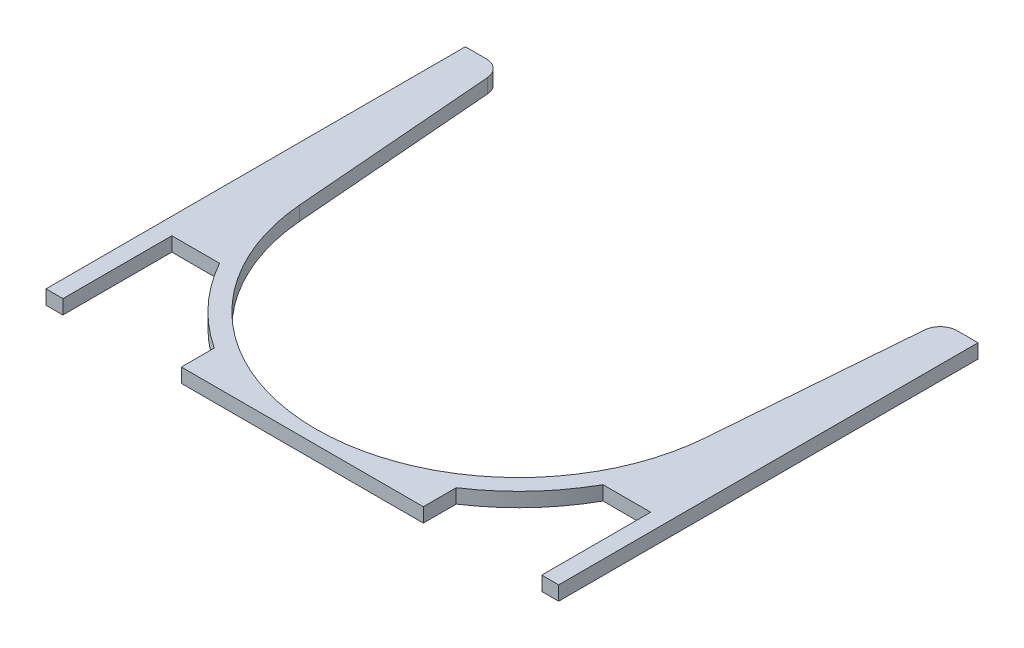
ISO-10303-21;
HEADER;
FILE_DESCRIPTION(('STEP AP214'),'2;1');
FILE_NAME('part.step','',(''),(''),'','','');
FILE_SCHEMA(('AUTOMOTIVE_DESIGN { 1 0 10303 214 1 1 1 1 }'));
ENDSEC;
DATA;
#1=APPLICATION_CONTEXT('core data for automotive mechanical design processes');
#2=APPLICATION_PROTOCOL_DEFINITION('international standard','automotive_design',2000,#1);
#3=PRODUCT_CONTEXT('',#1,'mechanical');
#4=PRODUCT('Part','Part','',(#3));
#5=PRODUCT_RELATED_PRODUCT_CATEGORY('part','',(#4));
#6=PRODUCT_DEFINITION_FORMATION('','',#4);
#7=PRODUCT_DEFINITION_CONTEXT('part definition',#1,'design');
#8=PRODUCT_DEFINITION('design','',#6,#7);
#9=PRODUCT_DEFINITION_SHAPE('','',#8);
#10=(LENGTH_UNIT() NAMED_UNIT(*) SI_UNIT(.MILLI.,.METRE.));
#11=(NAMED_UNIT(*) PLANE_ANGLE_UNIT() SI_UNIT($,.RADIAN.));
#12=(NAMED_UNIT(*) SI_UNIT($,.STERADIAN.) SOLID_ANGLE_UNIT());
#13=UNCERTAINTY_MEASURE_WITH_UNIT(LENGTH_MEASURE(1.E-05),#10,'distance_accuracy_value','');
#14=(GEOMETRIC_REPRESENTATION_CONTEXT(3) GLOBAL_UNCERTAINTY_ASSIGNED_CONTEXT((#13)) GLOBAL_UNIT_ASSIGNED_CONTEXT((#10,
#11,#12)) REPRESENTATION_CONTEXT('',''));
#15=CARTESIAN_POINT('',(0.,0.,0.));
#16=DIRECTION('',(0.,0.,1.));
#17=DIRECTION('',(1.,0.,0.));
#18=AXIS2_PLACEMENT_3D('',#15,#16,#17);
#19=CARTESIAN_POINT('',(0.,5.334,0.));
#20=DIRECTION('',(0.,0.,-1.));
#21=DIRECTION('',(-1.,0.,0.));
#22=AXIS2_PLACEMENT_3D('',#19,#20,#21);
#23=PLANE('',#22);
#24=DIRECTION('',(1.,0.,0.));
#25=VECTOR('',#24,1.);
#26=CARTESIAN_POINT('',(0.,5.334,0.));
#27=LINE('',#26,#25);
#28=CARTESIAN_POINT('',(186.182,5.334,0.));
#29=VERTEX_POINT('',#28);
#30=CARTESIAN_POINT('',(192.532,5.334,0.));
#31=VERTEX_POINT('',#30);
#32=EDGE_CURVE('E258',#29,#31,#27,.T.);
#33=ORIENTED_EDGE('',*,*,#32,.F.);
#34=DIRECTION('',(0.,1.,0.));
#35=VECTOR('',#34,1.);
#36=CARTESIAN_POINT('',(186.182,0.,0.));
#37=LINE('',#36,#35);
#38=CARTESIAN_POINT('',(186.182,0.,0.));
#39=VERTEX_POINT('',#38);
#40=EDGE_CURVE('E207',#39,#29,#37,.T.);
#41=ORIENTED_EDGE('',*,*,#40,.F.);
#42=DIRECTION('',(1.,0.,0.));
#43=VECTOR('',#42,1.);
#44=CARTESIAN_POINT('',(0.,0.,0.));
#45=LINE('',#44,#43);
#46=CARTESIAN_POINT('',(192.532,0.,0.));
#47=VERTEX_POINT('',#46);
#48=EDGE_CURVE('E273',#39,#47,#45,.T.);
#49=ORIENTED_EDGE('',*,*,#48,.T.);
#50=DIRECTION('',(0.,-1.,0.));
#51=VECTOR('',#50,1.);
#52=CARTESIAN_POINT('',(192.532,5.334,0.));
#53=LINE('',#52,#51);
#54=EDGE_CURVE('E288',#31,#47,#53,.T.);
#55=ORIENTED_EDGE('',*,*,#54,.F.);
#56=EDGE_LOOP('',(#33,#41,#49,#55));
#57=FACE_BOUND('',#56,.T.);
#58=ADVANCED_FACE('F32',(#57),#23,.F.);
#59=CARTESIAN_POINT('',(0.,0.,0.));
#60=VERTEX_POINT('',#59);
#61=CARTESIAN_POINT('',(6.35,0.,0.));
#62=VERTEX_POINT('',#61);
#63=EDGE_CURVE('E274',#60,#62,#45,.T.);
#64=ORIENTED_EDGE('',*,*,#63,.T.);
#65=DIRECTION('',(0.,1.,0.));
#66=VECTOR('',#65,1.);
#67=CARTESIAN_POINT('',(6.35,0.,0.));
#68=LINE('',#67,#66);
#69=CARTESIAN_POINT('',(6.35,5.334,0.));
#70=VERTEX_POINT('',#69);
#71=EDGE_CURVE('E221',#62,#70,#68,.T.);
#72=ORIENTED_EDGE('',*,*,#71,.T.);
#73=CARTESIAN_POINT('',(0.,5.334,0.));
#74=VERTEX_POINT('',#73);
#75=EDGE_CURVE('E260',#74,#70,#27,.T.);
#76=ORIENTED_EDGE('',*,*,#75,.F.);
#77=DIRECTION('',(0.,-1.,0.));
#78=VECTOR('',#77,1.);
#79=CARTESIAN_POINT('',(0.,5.334,0.));
#80=LINE('',#79,#78);
#81=EDGE_CURVE('E291',#74,#60,#80,.T.);
#82=ORIENTED_EDGE('',*,*,#81,.T.);
#83=EDGE_LOOP('',(#64,#72,#76,#82));
#84=FACE_BOUND('',#83,.T.);
#85=ADVANCED_FACE('F383',(#84),#23,.F.);
#86=CARTESIAN_POINT('',(0.,5.334,-157.48));
#87=DIRECTION('',(0.,0.,1.));
#88=DIRECTION('',(1.,0.,0.));
#89=AXIS2_PLACEMENT_3D('',#86,#87,#88);
#90=PLANE('',#89);
#91=DIRECTION('',(-1.,0.,0.));
#92=VECTOR('',#91,1.);
#93=CARTESIAN_POINT('',(0.,5.334,-157.48));
#94=LINE('',#93,#92);
#95=CARTESIAN_POINT('',(7.85449416382827,5.334,-157.48));
#96=VERTEX_POINT('',#95);
#97=CARTESIAN_POINT('',(0.,5.334,-157.48));
#98=VERTEX_POINT('',#97);
#99=EDGE_CURVE('E266',#96,#98,#94,.T.);
#100=ORIENTED_EDGE('',*,*,#99,.F.);
#101=DIRECTION('',(0.,-1.,0.));
#102=VECTOR('',#101,1.);
#103=CARTESIAN_POINT('',(7.85449416382827,5.334,-157.48));
#104=LINE('',#103,#102);
#105=CARTESIAN_POINT('',(7.85449416382827,0.,-157.48));
#106=VERTEX_POINT('',#105);
#107=EDGE_CURVE('E40',#96,#106,#104,.T.);
#108=ORIENTED_EDGE('',*,*,#107,.T.);
#109=DIRECTION('',(-1.,0.,0.));
#110=VECTOR('',#109,1.);
#111=CARTESIAN_POINT('',(0.,0.,-157.48));
#112=LINE('',#111,#110);
#113=CARTESIAN_POINT('',(0.,0.,-157.48));
#114=VERTEX_POINT('',#113);
#115=EDGE_CURVE('E280',#106,#114,#112,.T.);
#116=ORIENTED_EDGE('',*,*,#115,.T.);
#117=DIRECTION('',(0.,-1.,0.));
#118=VECTOR('',#117,1.);
#119=CARTESIAN_POINT('',(0.,5.334,-157.48));
#120=LINE('',#119,#118);
#121=EDGE_CURVE('E270',#98,#114,#120,.T.);
#122=ORIENTED_EDGE('',*,*,#121,.F.);
#123=EDGE_LOOP('',(#100,#108,#116,#122));
#124=FACE_BOUND('',#123,.T.);
#125=ADVANCED_FACE('F319',(#124),#90,.F.);
#126=CARTESIAN_POINT('',(0.,5.334,0.));
#127=DIRECTION('',(1.,0.,0.));
#128=DIRECTION('',(0.,0.,-1.));
#129=AXIS2_PLACEMENT_3D('',#126,#127,#128);
#130=PLANE('',#129);
#131=DIRECTION('',(0.,0.,1.));
#132=VECTOR('',#131,1.);
#133=CARTESIAN_POINT('',(0.,0.,0.));
#134=LINE('',#133,#132);
#135=EDGE_CURVE('E254',#114,#60,#134,.T.);
#136=ORIENTED_EDGE('',*,*,#135,.T.);
#137=ORIENTED_EDGE('',*,*,#81,.F.);
#138=DIRECTION('',(0.,0.,1.));
#139=VECTOR('',#138,1.);
#140=CARTESIAN_POINT('',(0.,5.334,0.));
#141=LINE('',#140,#139);
#142=EDGE_CURVE('E255',#98,#74,#141,.T.);
#143=ORIENTED_EDGE('',*,*,#142,.F.);
#144=ORIENTED_EDGE('',*,*,#121,.T.);
#145=EDGE_LOOP('',(#136,#137,#143,#144));
#146=FACE_BOUND('',#145,.T.);
#147=ADVANCED_FACE('F326',(#146),#130,.F.);
#148=CARTESIAN_POINT('',(50.8279765121096,0.,0.));
#149=VERTEX_POINT('',#148);
#150=CARTESIAN_POINT('',(141.70402348789,0.,0.));
#151=VERTEX_POINT('',#150);
#152=EDGE_CURVE('E278',#149,#151,#45,.T.);
#153=ORIENTED_EDGE('',*,*,#152,.T.);
#154=DIRECTION('',(0.,1.,0.));
#155=VECTOR('',#154,1.);
#156=CARTESIAN_POINT('',(141.70402348789,0.,0.));
#157=LINE('',#156,#155);
#158=CARTESIAN_POINT('',(141.70402348789,5.334,0.));
#159=VERTEX_POINT('',#158);
#160=EDGE_CURVE('E47',#151,#159,#157,.T.);
#161=ORIENTED_EDGE('',*,*,#160,.T.);
#162=CARTESIAN_POINT('',(50.8279765121096,5.334,0.));
#163=VERTEX_POINT('',#162);
#164=EDGE_CURVE('E264',#163,#159,#27,.T.);
#165=ORIENTED_EDGE('',*,*,#164,.F.);
#166=DIRECTION('',(0.,1.,0.));
#167=VECTOR('',#166,1.);
#168=CARTESIAN_POINT('',(50.8279765121096,0.,0.));
#169=LINE('',#168,#167);
#170=EDGE_CURVE('E238',#149,#163,#169,.T.);
#171=ORIENTED_EDGE('',*,*,#170,.F.);
#172=EDGE_LOOP('',(#153,#161,#165,#171));
#173=FACE_BOUND('',#172,.T.);
#174=ADVANCED_FACE('F368',(#173),#23,.F.);
#175=CARTESIAN_POINT('',(192.532,5.334,0.));
#176=DIRECTION('',(-1.,0.,0.));
#177=DIRECTION('',(0.,0.,1.));
#178=AXIS2_PLACEMENT_3D('',#175,#176,#177);
#179=PLANE('',#178);
#180=DIRECTION('',(0.,0.,-1.));
#181=VECTOR('',#180,1.);
#182=CARTESIAN_POINT('',(192.532,0.,0.));
#183=LINE('',#182,#181);
#184=CARTESIAN_POINT('',(192.532,0.,-157.48));
#185=VERTEX_POINT('',#184);
#186=EDGE_CURVE('E277',#47,#185,#183,.T.);
#187=ORIENTED_EDGE('',*,*,#186,.T.);
#188=DIRECTION('',(0.,-1.,0.));
#189=VECTOR('',#188,1.);
#190=CARTESIAN_POINT('',(192.532,5.334,-157.48));
#191=LINE('',#190,#189);
#192=CARTESIAN_POINT('',(192.532,5.334,-157.48));
#193=VERTEX_POINT('',#192);
#194=EDGE_CURVE('E285',#193,#185,#191,.T.);
#195=ORIENTED_EDGE('',*,*,#194,.F.);
#196=DIRECTION('',(0.,0.,-1.));
#197=VECTOR('',#196,1.);
#198=CARTESIAN_POINT('',(192.532,5.334,0.));
#199=LINE('',#198,#197);
#200=EDGE_CURVE('E263',#31,#193,#199,.T.);
#201=ORIENTED_EDGE('',*,*,#200,.F.);
#202=ORIENTED_EDGE('',*,*,#54,.T.);
#203=EDGE_LOOP('',(#187,#195,#201,#202));
#204=FACE_BOUND('',#203,.T.);
#205=ADVANCED_FACE('F362',(#204),#179,.F.);
#206=CARTESIAN_POINT('',(184.677505836172,0.,-157.48));
#207=VERTEX_POINT('',#206);
#208=EDGE_CURVE('E259',#185,#207,#112,.T.);
#209=ORIENTED_EDGE('',*,*,#208,.T.);
#210=DIRECTION('',(0.,-1.,0.));
#211=VECTOR('',#210,1.);
#212=CARTESIAN_POINT('',(184.677505836172,5.334,-157.48));
#213=LINE('',#212,#211);
#214=CARTESIAN_POINT('',(184.677505836172,5.334,-157.48));
#215=VERTEX_POINT('',#214);
#216=EDGE_CURVE('E309',#207,#215,#213,.F.);
#217=ORIENTED_EDGE('',*,*,#216,.T.);
#218=EDGE_CURVE('E267',#193,#215,#94,.T.);
#219=ORIENTED_EDGE('',*,*,#218,.F.);
#220=ORIENTED_EDGE('',*,*,#194,.T.);
#221=EDGE_LOOP('',(#209,#217,#219,#220));
#222=FACE_BOUND('',#221,.T.);
#223=ADVANCED_FACE('F352',(#222),#90,.F.);
#224=CARTESIAN_POINT('',(0.,5.334,0.));
#225=DIRECTION('',(0.,-1.,0.));
#226=DIRECTION('',(0.,0.,-1.));
#227=AXIS2_PLACEMENT_3D('',#224,#225,#226);
#228=PLANE('',#227);
#229=DIRECTION('',(-1.,0.,0.));
#230=VECTOR('',#229,1.);
#231=CARTESIAN_POINT('',(186.182,5.334,-40.9102037002555));
#232=LINE('',#231,#230);
#233=CARTESIAN_POINT('',(186.182,5.334,-40.9102037002555));
#234=VERTEX_POINT('',#233);
#235=CARTESIAN_POINT('',(168.271430675173,5.334,-40.9102037002555));
#236=VERTEX_POINT('',#235);
#237=EDGE_CURVE('E189',#234,#236,#232,.T.);
#238=ORIENTED_EDGE('',*,*,#237,.F.);
#239=DIRECTION('',(0.,0.,-1.));
#240=VECTOR('',#239,1.);
#241=CARTESIAN_POINT('',(186.182,5.334,-40.9102037002555));
#242=LINE('',#241,#240);
#243=EDGE_CURVE('E192',#29,#234,#242,.T.);
#244=ORIENTED_EDGE('',*,*,#243,.F.);
#245=ORIENTED_EDGE('',*,*,#32,.T.);
#246=ORIENTED_EDGE('',*,*,#200,.T.);
#247=ORIENTED_EDGE('',*,*,#218,.T.);
#248=CARTESIAN_POINT('',(184.677505836172,5.334,-151.13));
#249=DIRECTION('',(0.,-1.,0.));
#250=DIRECTION('',(0.,0.,-1.));
#251=AXIS2_PLACEMENT_3D('',#248,#249,#250);
#252=CIRCLE('',#251,6.35);
#253=CARTESIAN_POINT('',(178.347796190208,5.334,-151.637223617152));
#254=VERTEX_POINT('',#253);
#255=EDGE_CURVE('E313',#215,#254,#252,.F.);
#256=ORIENTED_EDGE('',*,*,#255,.T.);
#257=DIRECTION('',(-0.0798777349844939,0.,0.996804668655674));
#258=VECTOR('',#257,1.);
#259=CARTESIAN_POINT('',(165.136121830688,5.334,13.2329831417707));
#260=LINE('',#259,#258);
#261=CARTESIAN_POINT('',(172.200955718694,5.334,-74.93));
#262=VERTEX_POINT('',#261);
#263=EDGE_CURVE('E247',#254,#262,#260,.T.);
#264=ORIENTED_EDGE('',*,*,#263,.T.);
#265=CARTESIAN_POINT('',(96.266,5.334,-81.28));
#266=DIRECTION('',(0.,-1.,0.));
#267=DIRECTION('',(0.,0.,-1.));
#268=AXIS2_PLACEMENT_3D('',#265,#266,#267);
#269=CIRCLE('',#268,76.2);
#270=CARTESIAN_POINT('',(20.3310442813061,5.334,-74.93));
#271=VERTEX_POINT('',#270);
#272=EDGE_CURVE('E249',#262,#271,#269,.T.);
#273=ORIENTED_EDGE('',*,*,#272,.T.);
#274=DIRECTION('',(-0.0798777349844938,0.,-0.996804668655674));
#275=VECTOR('',#274,1.);
#276=CARTESIAN_POINT('',(26.1674368796765,5.334,-2.09689586538272));
#277=LINE('',#276,#275);
#278=CARTESIAN_POINT('',(14.1842038097918,5.334,-151.637223617152));
#279=VERTEX_POINT('',#278);
#280=EDGE_CURVE('E251',#271,#279,#277,.T.);
#281=ORIENTED_EDGE('',*,*,#280,.T.);
#282=CARTESIAN_POINT('',(7.85449416382827,5.334,-151.13));
#283=DIRECTION('',(0.,-1.,0.));
#284=DIRECTION('',(0.,0.,-1.));
#285=AXIS2_PLACEMENT_3D('',#282,#283,#284);
#286=CIRCLE('',#285,6.35);
#287=EDGE_CURVE('E311',#279,#96,#286,.F.);
#288=ORIENTED_EDGE('',*,*,#287,.T.);
#289=ORIENTED_EDGE('',*,*,#99,.T.);
#290=ORIENTED_EDGE('',*,*,#142,.T.);
#291=ORIENTED_EDGE('',*,*,#75,.T.);
#292=DIRECTION('',(0.,0.,1.));
#293=VECTOR('',#292,1.);
#294=CARTESIAN_POINT('',(6.35,5.334,-40.9102037002555));
#295=LINE('',#294,#293);
#296=CARTESIAN_POINT('',(6.35,5.334,-40.9102037002555));
#297=VERTEX_POINT('',#296);
#298=EDGE_CURVE('E204',#297,#70,#295,.T.);
#299=ORIENTED_EDGE('',*,*,#298,.F.);
#300=DIRECTION('',(-1.,0.,0.));
#301=VECTOR('',#300,1.);
#302=CARTESIAN_POINT('',(6.35,5.334,-40.9102037002555));
#303=LINE('',#302,#301);
#304=CARTESIAN_POINT('',(24.2605693248271,5.334,-40.9102037002555));
#305=VERTEX_POINT('',#304);
#306=EDGE_CURVE('E214',#305,#297,#303,.T.);
#307=ORIENTED_EDGE('',*,*,#306,.F.);
#308=CARTESIAN_POINT('',(96.266,5.334,-81.28));
#309=DIRECTION('',(0.,-1.,0.));
#310=DIRECTION('',(0.,0.,1.));
#311=AXIS2_PLACEMENT_3D('',#308,#309,#310);
#312=CIRCLE('',#311,82.55);
#313=CARTESIAN_POINT('',(50.8279765121096,5.334,-12.3605649942346));
#314=VERTEX_POINT('',#313);
#315=EDGE_CURVE('E226',#314,#305,#312,.T.);
#316=ORIENTED_EDGE('',*,*,#315,.F.);
#317=DIRECTION('',(0.,0.,-1.));
#318=VECTOR('',#317,1.);
#319=CARTESIAN_POINT('',(50.8279765121096,5.334,-12.3605649942346));
#320=LINE('',#319,#318);
#321=EDGE_CURVE('E223',#163,#314,#320,.T.);
#322=ORIENTED_EDGE('',*,*,#321,.F.);
#323=ORIENTED_EDGE('',*,*,#164,.T.);
#324=DIRECTION('',(0.,0.,1.));
#325=VECTOR('',#324,1.);
#326=CARTESIAN_POINT('',(141.70402348789,5.334,-12.3605649942346));
#327=LINE('',#326,#325);
#328=CARTESIAN_POINT('',(141.70402348789,5.334,-12.3605649942346));
#329=VERTEX_POINT('',#328);
#330=EDGE_CURVE('E198',#329,#159,#327,.T.);
#331=ORIENTED_EDGE('',*,*,#330,.F.);
#332=CARTESIAN_POINT('',(96.266,5.334,-81.28));
#333=DIRECTION('',(0.,-1.,0.));
#334=DIRECTION('',(0.,0.,-1.));
#335=AXIS2_PLACEMENT_3D('',#332,#333,#334);
#336=CIRCLE('',#335,82.55);
#337=EDGE_CURVE('E175',#236,#329,#336,.T.);
#338=ORIENTED_EDGE('',*,*,#337,.F.);
#339=EDGE_LOOP('',(#238,#244,#245,#246,#247,#256,#264,#273,#281,#288,#289,#290,#291,#299,#307,
#316,#322,#323,#331,#338));
#340=FACE_BOUND('',#339,.T.);
#341=ADVANCED_FACE('F330',(#340),#228,.F.);
#342=CARTESIAN_POINT('',(0.,0.,0.));
#343=DIRECTION('',(0.,-1.,0.));
#344=DIRECTION('',(0.,0.,-1.));
#345=AXIS2_PLACEMENT_3D('',#342,#343,#344);
#346=PLANE('',#345);
#347=DIRECTION('',(0.,0.,-1.));
#348=VECTOR('',#347,1.);
#349=CARTESIAN_POINT('',(186.182,0.,-40.9102037002555));
#350=LINE('',#349,#348);
#351=CARTESIAN_POINT('',(186.182,0.,-40.9102037002555));
#352=VERTEX_POINT('',#351);
#353=EDGE_CURVE('E184',#39,#352,#350,.T.);
#354=ORIENTED_EDGE('',*,*,#353,.T.);
#355=DIRECTION('',(-1.,0.,0.));
#356=VECTOR('',#355,1.);
#357=CARTESIAN_POINT('',(186.182,0.,-40.9102037002555));
#358=LINE('',#357,#356);
#359=CARTESIAN_POINT('',(168.271430675173,0.,-40.9102037002555));
#360=VERTEX_POINT('',#359);
#361=EDGE_CURVE('E177',#352,#360,#358,.T.);
#362=ORIENTED_EDGE('',*,*,#361,.T.);
#363=CARTESIAN_POINT('',(96.266,0.,-81.28));
#364=DIRECTION('',(0.,-1.,0.));
#365=DIRECTION('',(0.,0.,-1.));
#366=AXIS2_PLACEMENT_3D('',#363,#364,#365);
#367=CIRCLE('',#366,82.55);
#368=CARTESIAN_POINT('',(141.70402348789,0.,-12.3605649942346));
#369=VERTEX_POINT('',#368);
#370=EDGE_CURVE('E172',#360,#369,#367,.T.);
#371=ORIENTED_EDGE('',*,*,#370,.T.);
#372=DIRECTION('',(0.,0.,1.));
#373=VECTOR('',#372,1.);
#374=CARTESIAN_POINT('',(141.70402348789,0.,-12.3605649942346));
#375=LINE('',#374,#373);
#376=EDGE_CURVE('E179',#369,#151,#375,.T.);
#377=ORIENTED_EDGE('',*,*,#376,.T.);
#378=ORIENTED_EDGE('',*,*,#152,.F.);
#379=DIRECTION('',(0.,0.,-1.));
#380=VECTOR('',#379,1.);
#381=CARTESIAN_POINT('',(50.8279765121096,0.,-12.3605649942346));
#382=LINE('',#381,#380);
#383=CARTESIAN_POINT('',(50.8279765121096,0.,-12.3605649942346));
#384=VERTEX_POINT('',#383);
#385=EDGE_CURVE('E213',#149,#384,#382,.T.);
#386=ORIENTED_EDGE('',*,*,#385,.T.);
#387=CARTESIAN_POINT('',(96.266,0.,-81.28));
#388=DIRECTION('',(0.,-1.,0.));
#389=DIRECTION('',(0.,0.,1.));
#390=AXIS2_PLACEMENT_3D('',#387,#388,#389);
#391=CIRCLE('',#390,82.55);
#392=CARTESIAN_POINT('',(24.2605693248271,0.,-40.9102037002555));
#393=VERTEX_POINT('',#392);
#394=EDGE_CURVE('E55',#384,#393,#391,.T.);
#395=ORIENTED_EDGE('',*,*,#394,.T.);
#396=DIRECTION('',(-1.,0.,0.));
#397=VECTOR('',#396,1.);
#398=CARTESIAN_POINT('',(6.35,0.,-40.9102037002555));
#399=LINE('',#398,#397);
#400=CARTESIAN_POINT('',(6.35,0.,-40.9102037002555));
#401=VERTEX_POINT('',#400);
#402=EDGE_CURVE('E218',#393,#401,#399,.T.);
#403=ORIENTED_EDGE('',*,*,#402,.T.);
#404=DIRECTION('',(0.,0.,1.));
#405=VECTOR('',#404,1.);
#406=CARTESIAN_POINT('',(6.35,0.,-40.9102037002555));
#407=LINE('',#406,#405);
#408=EDGE_CURVE('E210',#401,#62,#407,.T.);
#409=ORIENTED_EDGE('',*,*,#408,.T.);
#410=ORIENTED_EDGE('',*,*,#63,.F.);
#411=ORIENTED_EDGE('',*,*,#135,.F.);
#412=ORIENTED_EDGE('',*,*,#115,.F.);
#413=CARTESIAN_POINT('',(7.85449416382827,0.,-151.13));
#414=DIRECTION('',(0.,-1.,0.));
#415=DIRECTION('',(0.,0.,-1.));
#416=AXIS2_PLACEMENT_3D('',#413,#414,#415);
#417=CIRCLE('',#416,6.35);
#418=CARTESIAN_POINT('',(14.1842038097918,0.,-151.637223617152));
#419=VERTEX_POINT('',#418);
#420=EDGE_CURVE('E305',#106,#419,#417,.T.);
#421=ORIENTED_EDGE('',*,*,#420,.T.);
#422=DIRECTION('',(-0.0798777349844938,0.,-0.996804668655674));
#423=VECTOR('',#422,1.);
#424=CARTESIAN_POINT('',(26.1674368796765,0.,-2.09689586538272));
#425=LINE('',#424,#423);
#426=CARTESIAN_POINT('',(20.3310442813061,0.,-74.93));
#427=VERTEX_POINT('',#426);
#428=EDGE_CURVE('E299',#427,#419,#425,.T.);
#429=ORIENTED_EDGE('',*,*,#428,.F.);
#430=CARTESIAN_POINT('',(96.266,0.,-81.28));
#431=DIRECTION('',(0.,-1.,0.));
#432=DIRECTION('',(0.,0.,-1.));
#433=AXIS2_PLACEMENT_3D('',#430,#431,#432);
#434=CIRCLE('',#433,76.2);
#435=CARTESIAN_POINT('',(172.200955718694,0.,-74.93));
#436=VERTEX_POINT('',#435);
#437=EDGE_CURVE('E296',#436,#427,#434,.T.);
#438=ORIENTED_EDGE('',*,*,#437,.F.);
#439=DIRECTION('',(-0.0798777349844939,0.,0.996804668655674));
#440=VECTOR('',#439,1.);
#441=CARTESIAN_POINT('',(165.136121830688,0.,13.2329831417707));
#442=LINE('',#441,#440);
#443=CARTESIAN_POINT('',(178.347796190208,0.,-151.637223617152));
#444=VERTEX_POINT('',#443);
#445=EDGE_CURVE('E294',#444,#436,#442,.T.);
#446=ORIENTED_EDGE('',*,*,#445,.F.);
#447=CARTESIAN_POINT('',(184.677505836172,0.,-151.13));
#448=DIRECTION('',(0.,-1.,0.));
#449=DIRECTION('',(0.,0.,-1.));
#450=AXIS2_PLACEMENT_3D('',#447,#448,#449);
#451=CIRCLE('',#450,6.35);
#452=EDGE_CURVE('E307',#444,#207,#451,.T.);
#453=ORIENTED_EDGE('',*,*,#452,.T.);
#454=ORIENTED_EDGE('',*,*,#208,.F.);
#455=ORIENTED_EDGE('',*,*,#186,.F.);
#456=ORIENTED_EDGE('',*,*,#48,.F.);
#457=EDGE_LOOP('',(#354,#362,#371,#377,#378,#386,#395,#403,#409,#410,#411,#412,#421,#429,#438,
#446,#453,#454,#455,#456));
#458=FACE_BOUND('',#457,.T.);
#459=ADVANCED_FACE('F187',(#458),#346,.T.);
#460=CARTESIAN_POINT('',(20.3310442813061,322.990278384767,-74.93));
#461=DIRECTION('',(-0.996804668655673,0.,0.0798777349844938));
#462=DIRECTION('',(0.0798777349844938,0.,0.996804668655674));
#463=AXIS2_PLACEMENT_3D('',#460,#461,#462);
#464=PLANE('',#463);
#465=ORIENTED_EDGE('',*,*,#428,.T.);
#466=DIRECTION('',(0.,-1.,0.));
#467=VECTOR('',#466,1.);
#468=CARTESIAN_POINT('',(14.1842038097918,322.990278384767,-151.637223617152));
#469=LINE('',#468,#467);
#470=EDGE_CURVE('E11',#419,#279,#469,.F.);
#471=ORIENTED_EDGE('',*,*,#470,.T.);
#472=ORIENTED_EDGE('',*,*,#280,.F.);
#473=DIRECTION('',(0.,-1.,0.));
#474=VECTOR('',#473,1.);
#475=CARTESIAN_POINT('',(20.3310442813061,322.990278384767,-74.93));
#476=LINE('',#475,#474);
#477=EDGE_CURVE('E244',#271,#427,#476,.T.);
#478=ORIENTED_EDGE('',*,*,#477,.T.);
#479=EDGE_LOOP('',(#465,#471,#472,#478));
#480=FACE_BOUND('',#479,.T.);
#481=ADVANCED_FACE('F335',(#480),#464,.F.);
#482=CARTESIAN_POINT('',(96.266,322.990278384767,-81.28));
#483=DIRECTION('',(0.,-1.,0.));
#484=DIRECTION('',(0.,0.,-1.));
#485=AXIS2_PLACEMENT_3D('',#482,#483,#484);
#486=CYLINDRICAL_SURFACE('',#485,76.2);
#487=ORIENTED_EDGE('',*,*,#272,.F.);
#488=DIRECTION('',(0.,-1.,0.));
#489=VECTOR('',#488,1.);
#490=CARTESIAN_POINT('',(172.200955718694,322.990278384767,-74.93));
#491=LINE('',#490,#489);
#492=EDGE_CURVE('E233',#262,#436,#491,.T.);
#493=ORIENTED_EDGE('',*,*,#492,.T.);
#494=ORIENTED_EDGE('',*,*,#437,.T.);
#495=ORIENTED_EDGE('',*,*,#477,.F.);
#496=EDGE_LOOP('',(#487,#493,#494,#495));
#497=FACE_BOUND('',#496,.T.);
#498=ADVANCED_FACE('F341',(#497),#486,.F.);
#499=CARTESIAN_POINT('',(172.200955718694,322.990278384767,-74.93));
#500=DIRECTION('',(0.996804668655673,0.,0.0798777349844938));
#501=DIRECTION('',(0.0798777349844939,0.,-0.996804668655674));
#502=AXIS2_PLACEMENT_3D('',#499,#500,#501);
#503=PLANE('',#502);
#504=ORIENTED_EDGE('',*,*,#263,.F.);
#505=DIRECTION('',(0.,-1.,0.));
#506=VECTOR('',#505,1.);
#507=CARTESIAN_POINT('',(178.347796190208,322.990278384767,-151.637223617152));
#508=LINE('',#507,#506);
#509=EDGE_CURVE('E302',#254,#444,#508,.T.);
#510=ORIENTED_EDGE('',*,*,#509,.T.);
#511=ORIENTED_EDGE('',*,*,#445,.T.);
#512=ORIENTED_EDGE('',*,*,#492,.F.);
#513=EDGE_LOOP('',(#504,#510,#511,#512));
#514=FACE_BOUND('',#513,.T.);
#515=ADVANCED_FACE('F345',(#514),#503,.F.);
#516=CARTESIAN_POINT('',(184.677505836172,322.990278384767,-151.13));
#517=DIRECTION('',(0.,-1.,0.));
#518=DIRECTION('',(0.,0.,-1.));
#519=AXIS2_PLACEMENT_3D('',#516,#517,#518);
#520=CYLINDRICAL_SURFACE('',#519,6.35);
#521=ORIENTED_EDGE('',*,*,#255,.F.);
#522=ORIENTED_EDGE('',*,*,#216,.F.);
#523=ORIENTED_EDGE('',*,*,#452,.F.);
#524=ORIENTED_EDGE('',*,*,#509,.F.);
#525=EDGE_LOOP('',(#521,#522,#523,#524));
#526=FACE_BOUND('',#525,.T.);
#527=ADVANCED_FACE('F356',(#526),#520,.T.);
#528=CARTESIAN_POINT('',(7.85449416382827,5.334,-151.13));
#529=DIRECTION('',(0.,-1.,0.));
#530=DIRECTION('',(0.,0.,-1.));
#531=AXIS2_PLACEMENT_3D('',#528,#529,#530);
#532=CYLINDRICAL_SURFACE('',#531,6.35);
#533=ORIENTED_EDGE('',*,*,#287,.F.);
#534=ORIENTED_EDGE('',*,*,#470,.F.);
#535=ORIENTED_EDGE('',*,*,#420,.F.);
#536=ORIENTED_EDGE('',*,*,#107,.F.);
#537=EDGE_LOOP('',(#533,#534,#535,#536));
#538=FACE_BOUND('',#537,.T.);
#539=ADVANCED_FACE('F34',(#538),#532,.T.);
#540=CARTESIAN_POINT('',(6.35,0.,-40.9102037002555));
#541=DIRECTION('',(-1.,0.,0.));
#542=DIRECTION('',(0.,0.,1.));
#543=AXIS2_PLACEMENT_3D('',#540,#541,#542);
#544=PLANE('',#543);
#545=ORIENTED_EDGE('',*,*,#298,.T.);
#546=ORIENTED_EDGE('',*,*,#71,.F.);
#547=ORIENTED_EDGE('',*,*,#408,.F.);
#548=DIRECTION('',(0.,1.,0.));
#549=VECTOR('',#548,1.);
#550=CARTESIAN_POINT('',(6.35,0.,-40.9102037002555));
#551=LINE('',#550,#549);
#552=EDGE_CURVE('E231',#401,#297,#551,.T.);
#553=ORIENTED_EDGE('',*,*,#552,.T.);
#554=EDGE_LOOP('',(#545,#546,#547,#553));
#555=FACE_BOUND('',#554,.T.);
#556=ADVANCED_FACE('F384',(#555),#544,.F.);
#557=CARTESIAN_POINT('',(6.35,0.,-40.9102037002555));
#558=DIRECTION('',(0.,0.,-1.));
#559=DIRECTION('',(-1.,0.,0.));
#560=AXIS2_PLACEMENT_3D('',#557,#558,#559);
#561=PLANE('',#560);
#562=ORIENTED_EDGE('',*,*,#306,.T.);
#563=ORIENTED_EDGE('',*,*,#552,.F.);
#564=ORIENTED_EDGE('',*,*,#402,.F.);
#565=DIRECTION('',(0.,1.,0.));
#566=VECTOR('',#565,1.);
#567=CARTESIAN_POINT('',(24.2605693248271,0.,-40.9102037002555));
#568=LINE('',#567,#566);
#569=EDGE_CURVE('E234',#393,#305,#568,.T.);
#570=ORIENTED_EDGE('',*,*,#569,.T.);
#571=EDGE_LOOP('',(#562,#563,#564,#570));
#572=FACE_BOUND('',#571,.T.);
#573=ADVANCED_FACE('F379',(#572),#561,.F.);
#574=CARTESIAN_POINT('',(96.266,0.,-81.28));
#575=DIRECTION('',(0.,1.,0.));
#576=DIRECTION('',(0.,0.,1.));
#577=AXIS2_PLACEMENT_3D('',#574,#575,#576);
#578=CYLINDRICAL_SURFACE('',#577,82.55);
#579=ORIENTED_EDGE('',*,*,#315,.T.);
#580=ORIENTED_EDGE('',*,*,#569,.F.);
#581=ORIENTED_EDGE('',*,*,#394,.F.);
#582=DIRECTION('',(0.,1.,0.));
#583=VECTOR('',#582,1.);
#584=CARTESIAN_POINT('',(50.8279765121096,0.,-12.3605649942346));
#585=LINE('',#584,#583);
#586=EDGE_CURVE('E236',#384,#314,#585,.T.);
#587=ORIENTED_EDGE('',*,*,#586,.T.);
#588=EDGE_LOOP('',(#579,#580,#581,#587));
#589=FACE_BOUND('',#588,.T.);
#590=ADVANCED_FACE('F375',(#589),#578,.T.);
#591=CARTESIAN_POINT('',(50.8279765121096,0.,-12.3605649942346));
#592=DIRECTION('',(1.,0.,0.));
#593=DIRECTION('',(0.,0.,-1.));
#594=AXIS2_PLACEMENT_3D('',#591,#592,#593);
#595=PLANE('',#594);
#596=ORIENTED_EDGE('',*,*,#321,.T.);
#597=ORIENTED_EDGE('',*,*,#586,.F.);
#598=ORIENTED_EDGE('',*,*,#385,.F.);
#599=ORIENTED_EDGE('',*,*,#170,.T.);
#600=EDGE_LOOP('',(#596,#597,#598,#599));
#601=FACE_BOUND('',#600,.T.);
#602=ADVANCED_FACE('F372',(#601),#595,.F.);
#603=CARTESIAN_POINT('',(96.266,0.,-81.28));
#604=DIRECTION('',(0.,1.,0.));
#605=DIRECTION('',(0.,0.,1.));
#606=AXIS2_PLACEMENT_3D('',#603,#604,#605);
#607=CYLINDRICAL_SURFACE('',#606,82.55);
#608=ORIENTED_EDGE('',*,*,#337,.T.);
#609=DIRECTION('',(0.,1.,0.));
#610=VECTOR('',#609,1.);
#611=CARTESIAN_POINT('',(141.70402348789,0.,-12.3605649942346));
#612=LINE('',#611,#610);
#613=EDGE_CURVE('E169',#369,#329,#612,.T.);
#614=ORIENTED_EDGE('',*,*,#613,.F.);
#615=ORIENTED_EDGE('',*,*,#370,.F.);
#616=DIRECTION('',(0.,1.,0.));
#617=VECTOR('',#616,1.);
#618=CARTESIAN_POINT('',(168.271430675173,0.,-40.9102037002555));
#619=LINE('',#618,#617);
#620=EDGE_CURVE('E202',#360,#236,#619,.T.);
#621=ORIENTED_EDGE('',*,*,#620,.T.);
#622=EDGE_LOOP('',(#608,#614,#615,#621));
#623=FACE_BOUND('',#622,.T.);
#624=ADVANCED_FACE('F170',(#623),#607,.T.);
#625=CARTESIAN_POINT('',(186.182,0.,-40.9102037002555));
#626=DIRECTION('',(0.,0.,-1.));
#627=DIRECTION('',(-1.,0.,0.));
#628=AXIS2_PLACEMENT_3D('',#625,#626,#627);
#629=PLANE('',#628);
#630=ORIENTED_EDGE('',*,*,#237,.T.);
#631=ORIENTED_EDGE('',*,*,#620,.F.);
#632=ORIENTED_EDGE('',*,*,#361,.F.);
#633=DIRECTION('',(0.,1.,0.));
#634=VECTOR('',#633,1.);
#635=CARTESIAN_POINT('',(186.182,0.,-40.9102037002555));
#636=LINE('',#635,#634);
#637=EDGE_CURVE('E205',#352,#234,#636,.T.);
#638=ORIENTED_EDGE('',*,*,#637,.T.);
#639=EDGE_LOOP('',(#630,#631,#632,#638));
#640=FACE_BOUND('',#639,.T.);
#641=ADVANCED_FACE('F525',(#640),#629,.F.);
#642=CARTESIAN_POINT('',(186.182,0.,-40.9102037002555));
#643=DIRECTION('',(1.,0.,0.));
#644=DIRECTION('',(0.,0.,-1.));
#645=AXIS2_PLACEMENT_3D('',#642,#643,#644);
#646=PLANE('',#645);
#647=ORIENTED_EDGE('',*,*,#243,.T.);
#648=ORIENTED_EDGE('',*,*,#637,.F.);
#649=ORIENTED_EDGE('',*,*,#353,.F.);
#650=ORIENTED_EDGE('',*,*,#40,.T.);
#651=EDGE_LOOP('',(#647,#648,#649,#650));
#652=FACE_BOUND('',#651,.T.);
#653=ADVANCED_FACE('F533',(#652),#646,.F.);
#654=CARTESIAN_POINT('',(141.70402348789,0.,-12.3605649942346));
#655=DIRECTION('',(-1.,0.,0.));
#656=DIRECTION('',(0.,0.,1.));
#657=AXIS2_PLACEMENT_3D('',#654,#655,#656);
#658=PLANE('',#657);
#659=ORIENTED_EDGE('',*,*,#330,.T.);
#660=ORIENTED_EDGE('',*,*,#160,.F.);
#661=ORIENTED_EDGE('',*,*,#376,.F.);
#662=ORIENTED_EDGE('',*,*,#613,.T.);
#663=EDGE_LOOP('',(#659,#660,#661,#662));
#664=FACE_BOUND('',#663,.T.);
#665=ADVANCED_FACE('F180',(#664),#658,.F.);
#666=CLOSED_SHELL('',(#58,#85,#125,#147,#174,#205,#223,#341,#459,#481,#498,#515,#527,#539,#556,
#573,#590,#602,#624,#641,#653,#665));
#667=MANIFOLD_SOLID_BREP('B2',#666);
#668=ADVANCED_BREP_SHAPE_REPRESENTATION('',(#18,#667),#14);
#669=SHAPE_DEFINITION_REPRESENTATION(#9,#668);
ENDSEC;
END-ISO-10303-21;
